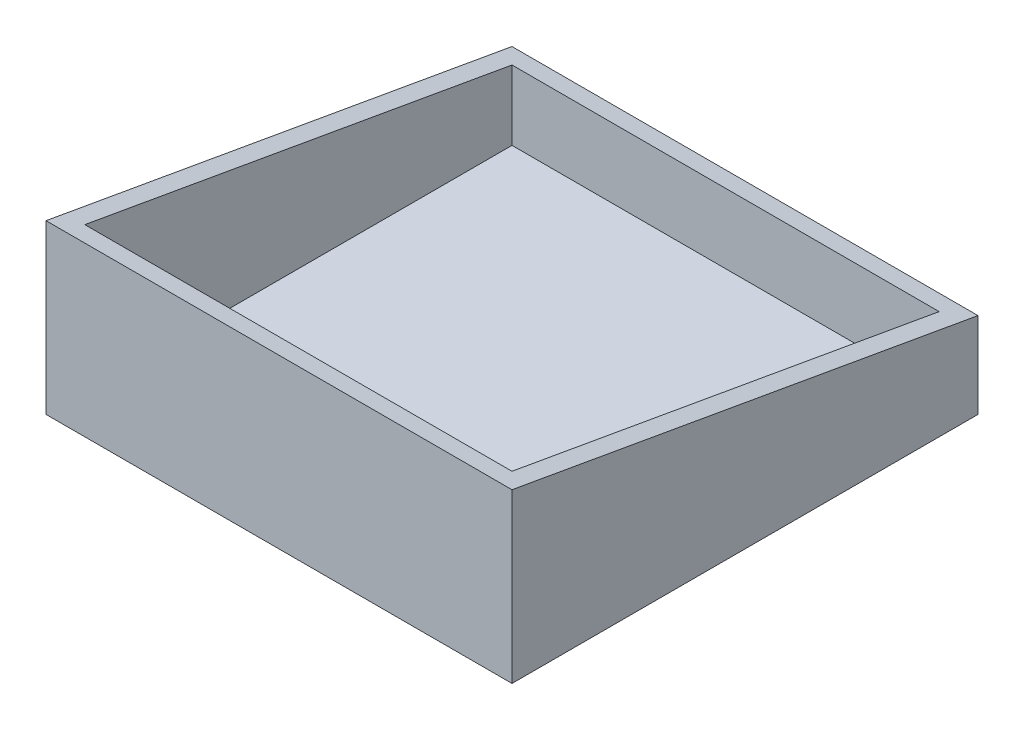
ISO-10303-21;
HEADER;
FILE_DESCRIPTION(('STEP AP214'),'2;1');
FILE_NAME('part.step','',(''),(''),'','','');
FILE_SCHEMA(('AUTOMOTIVE_DESIGN { 1 0 10303 214 1 1 1 1 }'));
ENDSEC;
DATA;
#1=APPLICATION_CONTEXT('core data for automotive mechanical design processes');
#2=APPLICATION_PROTOCOL_DEFINITION('international standard','automotive_design',2000,#1);
#3=PRODUCT_CONTEXT('',#1,'mechanical');
#4=PRODUCT('Part','Part','',(#3));
#5=PRODUCT_RELATED_PRODUCT_CATEGORY('part','',(#4));
#6=PRODUCT_DEFINITION_FORMATION('','',#4);
#7=PRODUCT_DEFINITION_CONTEXT('part definition',#1,'design');
#8=PRODUCT_DEFINITION('design','',#6,#7);
#9=PRODUCT_DEFINITION_SHAPE('','',#8);
#10=(LENGTH_UNIT() NAMED_UNIT(*) SI_UNIT(.MILLI.,.METRE.));
#11=(NAMED_UNIT(*) PLANE_ANGLE_UNIT() SI_UNIT($,.RADIAN.));
#12=(NAMED_UNIT(*) SI_UNIT($,.STERADIAN.) SOLID_ANGLE_UNIT());
#13=UNCERTAINTY_MEASURE_WITH_UNIT(LENGTH_MEASURE(1.E-05),#10,'distance_accuracy_value','');
#14=(GEOMETRIC_REPRESENTATION_CONTEXT(3) GLOBAL_UNCERTAINTY_ASSIGNED_CONTEXT((#13)) GLOBAL_UNIT_ASSIGNED_CONTEXT((#10,
#11,#12)) REPRESENTATION_CONTEXT('',''));
#15=CARTESIAN_POINT('',(0.,0.,0.));
#16=DIRECTION('',(0.,0.,1.));
#17=DIRECTION('',(1.,0.,0.));
#18=AXIS2_PLACEMENT_3D('',#15,#16,#17);
#19=CARTESIAN_POINT('',(304.8,109.74446371994,0.));
#20=DIRECTION('',(0.,-0.984807753012208,0.173648177666931));
#21=DIRECTION('',(0.,-0.173648177666931,-0.984807753012208));
#22=AXIS2_PLACEMENT_3D('',#19,#20,#21);
#23=PLANE('',#22);
#24=DIRECTION('',(0.,0.173648177666931,0.984807753012208));
#25=VECTOR('',#24,1.);
#26=CARTESIAN_POINT('',(0.,109.74446371994,0.));
#27=LINE('',#26,#25);
#28=CARTESIAN_POINT('',(0.,56.,-304.8));
#29=VERTEX_POINT('',#28);
#30=CARTESIAN_POINT('',(0.,109.74446371994,0.));
#31=VERTEX_POINT('',#30);
#32=EDGE_CURVE('E82',#29,#31,#27,.T.);
#33=ORIENTED_EDGE('',*,*,#32,.T.);
#34=DIRECTION('',(-1.,0.,0.));
#35=VECTOR('',#34,1.);
#36=CARTESIAN_POINT('',(304.8,109.74446371994,0.));
#37=LINE('',#36,#35);
#38=CARTESIAN_POINT('',(304.8,109.74446371994,0.));
#39=VERTEX_POINT('',#38);
#40=EDGE_CURVE('E154',#39,#31,#37,.T.);
#41=ORIENTED_EDGE('',*,*,#40,.F.);
#42=DIRECTION('',(0.,0.173648177666931,0.984807753012208));
#43=VECTOR('',#42,1.);
#44=CARTESIAN_POINT('',(304.8,109.74446371994,0.));
#45=LINE('',#44,#43);
#46=CARTESIAN_POINT('',(304.8,56.,-304.8));
#47=VERTEX_POINT('',#46);
#48=EDGE_CURVE('E61',#47,#39,#45,.T.);
#49=ORIENTED_EDGE('',*,*,#48,.F.);
#50=DIRECTION('',(-1.,0.,0.));
#51=VECTOR('',#50,1.);
#52=CARTESIAN_POINT('',(304.8,56.,-304.8));
#53=LINE('',#52,#51);
#54=EDGE_CURVE('E164',#47,#29,#53,.T.);
#55=ORIENTED_EDGE('',*,*,#54,.T.);
#56=EDGE_LOOP('',(#33,#41,#49,#55));
#57=FACE_BOUND('',#56,.T.);
#58=DIRECTION('',(0.,0.173648177666931,0.984807753012208));
#59=VECTOR('',#58,1.);
#60=CARTESIAN_POINT('',(12.7,109.74446371994,0.));
#61=LINE('',#60,#59);
#62=CARTESIAN_POINT('',(12.7,58.2393526549975,-292.1));
#63=VERTEX_POINT('',#62);
#64=CARTESIAN_POINT('',(12.7,107.505111064943,-12.7));
#65=VERTEX_POINT('',#64);
#66=EDGE_CURVE('E135',#63,#65,#61,.T.);
#67=ORIENTED_EDGE('',*,*,#66,.F.);
#68=DIRECTION('',(-1.,0.,0.));
#69=VECTOR('',#68,1.);
#70=CARTESIAN_POINT('',(304.8,58.2393526549975,-292.1));
#71=LINE('',#70,#69);
#72=CARTESIAN_POINT('',(292.1,58.2393526549975,-292.1));
#73=VERTEX_POINT('',#72);
#74=EDGE_CURVE('E130',#73,#63,#71,.T.);
#75=ORIENTED_EDGE('',*,*,#74,.F.);
#76=DIRECTION('',(0.,0.173648177666931,0.984807753012208));
#77=VECTOR('',#76,1.);
#78=CARTESIAN_POINT('',(292.1,109.74446371994,0.));
#79=LINE('',#78,#77);
#80=CARTESIAN_POINT('',(292.1,107.505111064943,-12.7));
#81=VERTEX_POINT('',#80);
#82=EDGE_CURVE('E52',#73,#81,#79,.T.);
#83=ORIENTED_EDGE('',*,*,#82,.T.);
#84=DIRECTION('',(-1.,0.,0.));
#85=VECTOR('',#84,1.);
#86=CARTESIAN_POINT('',(304.8,107.505111064943,-12.7));
#87=LINE('',#86,#85);
#88=EDGE_CURVE('E143',#81,#65,#87,.T.);
#89=ORIENTED_EDGE('',*,*,#88,.T.);
#90=EDGE_LOOP('',(#67,#75,#83,#89));
#91=FACE_BOUND('',#90,.T.);
#92=ADVANCED_FACE('F37',(#57,#91),#23,.F.);
#93=CARTESIAN_POINT('',(304.8,109.74446371994,0.));
#94=DIRECTION('',(0.,0.,-1.));
#95=DIRECTION('',(0.,1.,0.));
#96=AXIS2_PLACEMENT_3D('',#93,#94,#95);
#97=PLANE('',#96);
#98=DIRECTION('',(0.,-1.,0.));
#99=VECTOR('',#98,1.);
#100=CARTESIAN_POINT('',(0.,109.74446371994,0.));
#101=LINE('',#100,#99);
#102=CARTESIAN_POINT('',(0.,0.,0.));
#103=VERTEX_POINT('',#102);
#104=EDGE_CURVE('E155',#31,#103,#101,.T.);
#105=ORIENTED_EDGE('',*,*,#104,.T.);
#106=DIRECTION('',(-1.,0.,0.));
#107=VECTOR('',#106,1.);
#108=CARTESIAN_POINT('',(304.8,0.,0.));
#109=LINE('',#108,#107);
#110=CARTESIAN_POINT('',(304.8,0.,0.));
#111=VERTEX_POINT('',#110);
#112=EDGE_CURVE('E11',#111,#103,#109,.T.);
#113=ORIENTED_EDGE('',*,*,#112,.F.);
#114=DIRECTION('',(0.,-1.,0.));
#115=VECTOR('',#114,1.);
#116=CARTESIAN_POINT('',(304.8,109.74446371994,0.));
#117=LINE('',#116,#115);
#118=EDGE_CURVE('E148',#39,#111,#117,.T.);
#119=ORIENTED_EDGE('',*,*,#118,.F.);
#120=ORIENTED_EDGE('',*,*,#40,.T.);
#121=EDGE_LOOP('',(#105,#113,#119,#120));
#122=FACE_BOUND('',#121,.T.);
#123=ADVANCED_FACE('F39',(#122),#97,.F.);
#124=CARTESIAN_POINT('',(304.8,0.,0.));
#125=DIRECTION('',(0.,1.,0.));
#126=DIRECTION('',(0.,0.,1.));
#127=AXIS2_PLACEMENT_3D('',#124,#125,#126);
#128=PLANE('',#127);
#129=DIRECTION('',(0.,0.,-1.));
#130=VECTOR('',#129,1.);
#131=CARTESIAN_POINT('',(0.,0.,0.));
#132=LINE('',#131,#130);
#133=CARTESIAN_POINT('',(0.,0.,-304.8));
#134=VERTEX_POINT('',#133);
#135=EDGE_CURVE('E158',#103,#134,#132,.T.);
#136=ORIENTED_EDGE('',*,*,#135,.T.);
#137=DIRECTION('',(-1.,0.,0.));
#138=VECTOR('',#137,1.);
#139=CARTESIAN_POINT('',(304.8,0.,-304.8));
#140=LINE('',#139,#138);
#141=CARTESIAN_POINT('',(304.8,0.,-304.8));
#142=VERTEX_POINT('',#141);
#143=EDGE_CURVE('E45',#142,#134,#140,.T.);
#144=ORIENTED_EDGE('',*,*,#143,.F.);
#145=DIRECTION('',(0.,0.,-1.));
#146=VECTOR('',#145,1.);
#147=CARTESIAN_POINT('',(304.8,0.,0.));
#148=LINE('',#147,#146);
#149=EDGE_CURVE('E89',#111,#142,#148,.T.);
#150=ORIENTED_EDGE('',*,*,#149,.F.);
#151=ORIENTED_EDGE('',*,*,#112,.T.);
#152=EDGE_LOOP('',(#136,#144,#150,#151));
#153=FACE_BOUND('',#152,.T.);
#154=ADVANCED_FACE('F203',(#153),#128,.F.);
#155=CARTESIAN_POINT('',(304.8,0.,-304.8));
#156=DIRECTION('',(0.,0.,1.));
#157=DIRECTION('',(1.,0.,0.));
#158=AXIS2_PLACEMENT_3D('',#155,#156,#157);
#159=PLANE('',#158);
#160=DIRECTION('',(0.,1.,0.));
#161=VECTOR('',#160,1.);
#162=CARTESIAN_POINT('',(0.,0.,-304.8));
#163=LINE('',#162,#161);
#164=EDGE_CURVE('E160',#134,#29,#163,.T.);
#165=ORIENTED_EDGE('',*,*,#164,.T.);
#166=ORIENTED_EDGE('',*,*,#54,.F.);
#167=DIRECTION('',(0.,1.,0.));
#168=VECTOR('',#167,1.);
#169=CARTESIAN_POINT('',(304.8,0.,-304.8));
#170=LINE('',#169,#168);
#171=EDGE_CURVE('E151',#142,#47,#170,.T.);
#172=ORIENTED_EDGE('',*,*,#171,.F.);
#173=ORIENTED_EDGE('',*,*,#143,.T.);
#174=EDGE_LOOP('',(#165,#166,#172,#173));
#175=FACE_BOUND('',#174,.T.);
#176=ADVANCED_FACE('F169',(#175),#159,.F.);
#177=CARTESIAN_POINT('',(304.8,0.,0.));
#178=DIRECTION('',(1.,0.,0.));
#179=DIRECTION('',(0.,0.,-1.));
#180=AXIS2_PLACEMENT_3D('',#177,#178,#179);
#181=PLANE('',#180);
#182=ORIENTED_EDGE('',*,*,#118,.T.);
#183=ORIENTED_EDGE('',*,*,#149,.T.);
#184=ORIENTED_EDGE('',*,*,#171,.T.);
#185=ORIENTED_EDGE('',*,*,#48,.T.);
#186=EDGE_LOOP('',(#182,#183,#184,#185));
#187=FACE_BOUND('',#186,.T.);
#188=ADVANCED_FACE('F197',(#187),#181,.T.);
#189=CARTESIAN_POINT('',(0.,0.,0.));
#190=DIRECTION('',(1.,0.,0.));
#191=DIRECTION('',(0.,0.,-1.));
#192=AXIS2_PLACEMENT_3D('',#189,#190,#191);
#193=PLANE('',#192);
#194=ORIENTED_EDGE('',*,*,#104,.F.);
#195=ORIENTED_EDGE('',*,*,#32,.F.);
#196=ORIENTED_EDGE('',*,*,#164,.F.);
#197=ORIENTED_EDGE('',*,*,#135,.F.);
#198=EDGE_LOOP('',(#194,#195,#196,#197));
#199=FACE_BOUND('',#198,.T.);
#200=ADVANCED_FACE('F173',(#199),#193,.F.);
#201=CARTESIAN_POINT('',(304.8,109.74446371994,-12.7));
#202=DIRECTION('',(0.,0.,-1.));
#203=DIRECTION('',(0.,1.,0.));
#204=AXIS2_PLACEMENT_3D('',#201,#202,#203);
#205=PLANE('',#204);
#206=DIRECTION('',(0.,-1.,0.));
#207=VECTOR('',#206,1.);
#208=CARTESIAN_POINT('',(12.7,109.74446371994,-12.7));
#209=LINE('',#208,#207);
#210=CARTESIAN_POINT('',(12.7,12.7,-12.7));
#211=VERTEX_POINT('',#210);
#212=EDGE_CURVE('E119',#65,#211,#209,.T.);
#213=ORIENTED_EDGE('',*,*,#212,.F.);
#214=ORIENTED_EDGE('',*,*,#88,.F.);
#215=DIRECTION('',(0.,-1.,0.));
#216=VECTOR('',#215,1.);
#217=CARTESIAN_POINT('',(292.1,109.74446371994,-12.7));
#218=LINE('',#217,#216);
#219=CARTESIAN_POINT('',(292.1,12.7,-12.7));
#220=VERTEX_POINT('',#219);
#221=EDGE_CURVE('E137',#81,#220,#218,.T.);
#222=ORIENTED_EDGE('',*,*,#221,.T.);
#223=DIRECTION('',(-1.,0.,0.));
#224=VECTOR('',#223,1.);
#225=CARTESIAN_POINT('',(304.8,12.7,-12.7));
#226=LINE('',#225,#224);
#227=EDGE_CURVE('E129',#220,#211,#226,.T.);
#228=ORIENTED_EDGE('',*,*,#227,.T.);
#229=EDGE_LOOP('',(#213,#214,#222,#228));
#230=FACE_BOUND('',#229,.T.);
#231=ADVANCED_FACE('F181',(#230),#205,.T.);
#232=CARTESIAN_POINT('',(304.8,12.7,0.));
#233=DIRECTION('',(0.,1.,0.));
#234=DIRECTION('',(0.,0.,1.));
#235=AXIS2_PLACEMENT_3D('',#232,#233,#234);
#236=PLANE('',#235);
#237=DIRECTION('',(0.,0.,-1.));
#238=VECTOR('',#237,1.);
#239=CARTESIAN_POINT('',(12.7,12.7,0.));
#240=LINE('',#239,#238);
#241=CARTESIAN_POINT('',(12.7,12.7,-292.1));
#242=VERTEX_POINT('',#241);
#243=EDGE_CURVE('E112',#211,#242,#240,.T.);
#244=ORIENTED_EDGE('',*,*,#243,.F.);
#245=ORIENTED_EDGE('',*,*,#227,.F.);
#246=DIRECTION('',(0.,0.,-1.));
#247=VECTOR('',#246,1.);
#248=CARTESIAN_POINT('',(292.1,12.7,0.));
#249=LINE('',#248,#247);
#250=CARTESIAN_POINT('',(292.1,12.7,-292.1));
#251=VERTEX_POINT('',#250);
#252=EDGE_CURVE('E127',#220,#251,#249,.T.);
#253=ORIENTED_EDGE('',*,*,#252,.T.);
#254=DIRECTION('',(-1.,0.,0.));
#255=VECTOR('',#254,1.);
#256=CARTESIAN_POINT('',(304.8,12.7,-292.1));
#257=LINE('',#256,#255);
#258=EDGE_CURVE('E125',#251,#242,#257,.T.);
#259=ORIENTED_EDGE('',*,*,#258,.T.);
#260=EDGE_LOOP('',(#244,#245,#253,#259));
#261=FACE_BOUND('',#260,.T.);
#262=ADVANCED_FACE('F126',(#261),#236,.T.);
#263=CARTESIAN_POINT('',(304.8,0.,-292.1));
#264=DIRECTION('',(0.,0.,1.));
#265=DIRECTION('',(1.,0.,0.));
#266=AXIS2_PLACEMENT_3D('',#263,#264,#265);
#267=PLANE('',#266);
#268=DIRECTION('',(0.,1.,0.));
#269=VECTOR('',#268,1.);
#270=CARTESIAN_POINT('',(12.7,0.,-292.1));
#271=LINE('',#270,#269);
#272=EDGE_CURVE('E116',#242,#63,#271,.T.);
#273=ORIENTED_EDGE('',*,*,#272,.F.);
#274=ORIENTED_EDGE('',*,*,#258,.F.);
#275=DIRECTION('',(0.,1.,0.));
#276=VECTOR('',#275,1.);
#277=CARTESIAN_POINT('',(292.1,0.,-292.1));
#278=LINE('',#277,#276);
#279=EDGE_CURVE('E141',#251,#73,#278,.T.);
#280=ORIENTED_EDGE('',*,*,#279,.T.);
#281=ORIENTED_EDGE('',*,*,#74,.T.);
#282=EDGE_LOOP('',(#273,#274,#280,#281));
#283=FACE_BOUND('',#282,.T.);
#284=ADVANCED_FACE('F132',(#283),#267,.T.);
#285=CARTESIAN_POINT('',(292.1,0.,0.));
#286=DIRECTION('',(1.,0.,0.));
#287=DIRECTION('',(0.,0.,-1.));
#288=AXIS2_PLACEMENT_3D('',#285,#286,#287);
#289=PLANE('',#288);
#290=ORIENTED_EDGE('',*,*,#221,.F.);
#291=ORIENTED_EDGE('',*,*,#82,.F.);
#292=ORIENTED_EDGE('',*,*,#279,.F.);
#293=ORIENTED_EDGE('',*,*,#252,.F.);
#294=EDGE_LOOP('',(#290,#291,#292,#293));
#295=FACE_BOUND('',#294,.T.);
#296=ADVANCED_FACE('F186',(#295),#289,.F.);
#297=CARTESIAN_POINT('',(12.7,0.,0.));
#298=DIRECTION('',(1.,0.,0.));
#299=DIRECTION('',(0.,0.,-1.));
#300=AXIS2_PLACEMENT_3D('',#297,#298,#299);
#301=PLANE('',#300);
#302=ORIENTED_EDGE('',*,*,#212,.T.);
#303=ORIENTED_EDGE('',*,*,#243,.T.);
#304=ORIENTED_EDGE('',*,*,#272,.T.);
#305=ORIENTED_EDGE('',*,*,#66,.T.);
#306=EDGE_LOOP('',(#302,#303,#304,#305));
#307=FACE_BOUND('',#306,.T.);
#308=ADVANCED_FACE('F114',(#307),#301,.T.);
#309=CLOSED_SHELL('',(#92,#123,#154,#176,#188,#200,#231,#262,#284,#296,#308));
#310=MANIFOLD_SOLID_BREP('B2',#309);
#311=ADVANCED_BREP_SHAPE_REPRESENTATION('',(#18,#310),#14);
#312=SHAPE_DEFINITION_REPRESENTATION(#9,#311);
ENDSEC;
END-ISO-10303-21;
